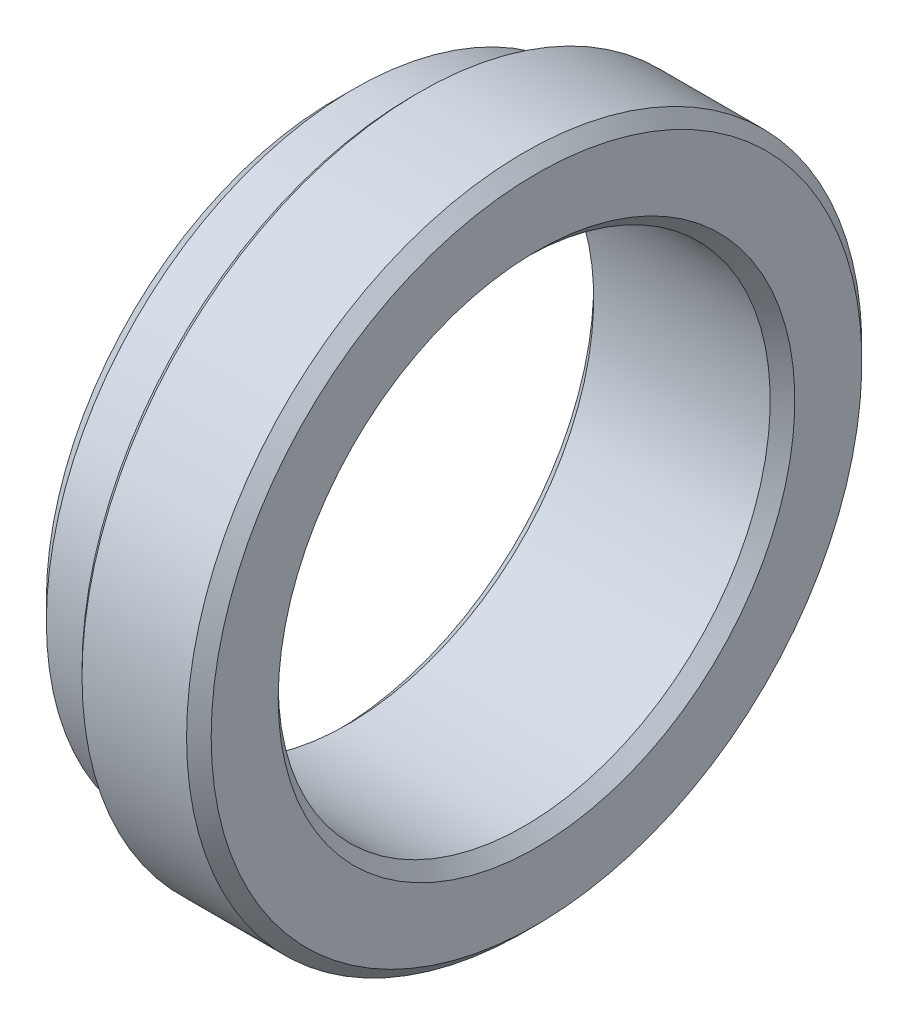
ISO-10303-21;
HEADER;
FILE_DESCRIPTION(('STEP AP214'),'2;1');
FILE_NAME('part.step','',(''),(''),'','','');
FILE_SCHEMA(('AUTOMOTIVE_DESIGN { 1 0 10303 214 1 1 1 1 }'));
ENDSEC;
DATA;
#1=APPLICATION_CONTEXT('core data for automotive mechanical design processes');
#2=APPLICATION_PROTOCOL_DEFINITION('international standard','automotive_design',2000,#1);
#3=PRODUCT_CONTEXT('',#1,'mechanical');
#4=PRODUCT('Part','Part','',(#3));
#5=PRODUCT_RELATED_PRODUCT_CATEGORY('part','',(#4));
#6=PRODUCT_DEFINITION_FORMATION('','',#4);
#7=PRODUCT_DEFINITION_CONTEXT('part definition',#1,'design');
#8=PRODUCT_DEFINITION('design','',#6,#7);
#9=PRODUCT_DEFINITION_SHAPE('','',#8);
#10=(LENGTH_UNIT() NAMED_UNIT(*) SI_UNIT(.MILLI.,.METRE.));
#11=(NAMED_UNIT(*) PLANE_ANGLE_UNIT() SI_UNIT($,.RADIAN.));
#12=(NAMED_UNIT(*) SI_UNIT($,.STERADIAN.) SOLID_ANGLE_UNIT());
#13=UNCERTAINTY_MEASURE_WITH_UNIT(LENGTH_MEASURE(1.E-05),#10,'distance_accuracy_value','');
#14=(GEOMETRIC_REPRESENTATION_CONTEXT(3) GLOBAL_UNCERTAINTY_ASSIGNED_CONTEXT((#13)) GLOBAL_UNIT_ASSIGNED_CONTEXT((#10,
#11,#12)) REPRESENTATION_CONTEXT('',''));
#15=CARTESIAN_POINT('',(0.,0.,0.));
#16=DIRECTION('',(0.,0.,1.));
#17=DIRECTION('',(1.,0.,0.));
#18=AXIS2_PLACEMENT_3D('',#15,#16,#17);
#19=CARTESIAN_POINT('',(0.,0.,0.));
#20=DIRECTION('',(-1.,0.,0.));
#21=DIRECTION('',(0.,0.,1.));
#22=AXIS2_PLACEMENT_3D('',#19,#20,#21);
#23=CONICAL_SURFACE('',#22,21.,0.785398163397449);
#24=CARTESIAN_POINT('',(1.,0.,0.));
#25=DIRECTION('',(-1.,0.,0.));
#26=DIRECTION('',(0.,0.,1.));
#27=AXIS2_PLACEMENT_3D('',#24,#25,#26);
#28=CIRCLE('',#27,20.);
#29=CARTESIAN_POINT('',(1.,0.,20.));
#30=VERTEX_POINT('',#29);
#31=EDGE_CURVE('E11',#30,#30,#28,.T.);
#32=ORIENTED_EDGE('',*,*,#31,.F.);
#33=EDGE_LOOP('',(#32));
#34=FACE_BOUND('',#33,.T.);
#35=CARTESIAN_POINT('',(0.,0.,0.));
#36=DIRECTION('',(-1.,0.,0.));
#37=DIRECTION('',(0.,0.,1.));
#38=AXIS2_PLACEMENT_3D('',#35,#36,#37);
#39=CIRCLE('',#38,21.);
#40=CARTESIAN_POINT('',(0.,0.,21.));
#41=VERTEX_POINT('',#40);
#42=EDGE_CURVE('E90',#41,#41,#39,.T.);
#43=ORIENTED_EDGE('',*,*,#42,.T.);
#44=EDGE_LOOP('',(#43));
#45=FACE_BOUND('',#44,.T.);
#46=ADVANCED_FACE('F50',(#34,#45),#23,.F.);
#47=CARTESIAN_POINT('',(0.,0.,0.));
#48=DIRECTION('',(-1.,0.,0.));
#49=DIRECTION('',(0.,0.,1.));
#50=AXIS2_PLACEMENT_3D('',#47,#48,#49);
#51=CYLINDRICAL_SURFACE('',#50,20.);
#52=CARTESIAN_POINT('',(15.35,0.,0.));
#53=DIRECTION('',(-1.,0.,0.));
#54=DIRECTION('',(0.,0.,1.));
#55=AXIS2_PLACEMENT_3D('',#52,#53,#54);
#56=CIRCLE('',#55,20.);
#57=CARTESIAN_POINT('',(15.35,0.,20.));
#58=VERTEX_POINT('',#57);
#59=EDGE_CURVE('E56',#58,#58,#56,.T.);
#60=ORIENTED_EDGE('',*,*,#59,.F.);
#61=EDGE_LOOP('',(#60));
#62=FACE_BOUND('',#61,.T.);
#63=ORIENTED_EDGE('',*,*,#31,.T.);
#64=EDGE_LOOP('',(#63));
#65=FACE_BOUND('',#64,.T.);
#66=ADVANCED_FACE('F151',(#62,#65),#51,.F.);
#67=CARTESIAN_POINT('',(15.35,0.,0.));
#68=DIRECTION('',(1.,0.,0.));
#69=DIRECTION('',(0.,0.,-1.));
#70=AXIS2_PLACEMENT_3D('',#67,#68,#69);
#71=CONICAL_SURFACE('',#70,20.,0.785398163397448);
#72=CARTESIAN_POINT('',(16.35,0.,0.));
#73=DIRECTION('',(-1.,0.,0.));
#74=DIRECTION('',(0.,0.,1.));
#75=AXIS2_PLACEMENT_3D('',#72,#73,#74);
#76=CIRCLE('',#75,21.);
#77=CARTESIAN_POINT('',(16.35,0.,21.));
#78=VERTEX_POINT('',#77);
#79=EDGE_CURVE('E60',#78,#78,#76,.T.);
#80=ORIENTED_EDGE('',*,*,#79,.F.);
#81=EDGE_LOOP('',(#80));
#82=FACE_BOUND('',#81,.T.);
#83=ORIENTED_EDGE('',*,*,#59,.T.);
#84=EDGE_LOOP('',(#83));
#85=FACE_BOUND('',#84,.T.);
#86=ADVANCED_FACE('F146',(#82,#85),#71,.F.);
#87=CARTESIAN_POINT('',(16.35,21.,0.));
#88=DIRECTION('',(-1.,0.,0.));
#89=DIRECTION('',(0.,0.,1.));
#90=AXIS2_PLACEMENT_3D('',#87,#88,#89);
#91=PLANE('',#90);
#92=CARTESIAN_POINT('',(16.35,0.,0.));
#93=DIRECTION('',(-1.,0.,0.));
#94=DIRECTION('',(0.,0.,1.));
#95=AXIS2_PLACEMENT_3D('',#92,#93,#94);
#96=CIRCLE('',#95,26.45);
#97=CARTESIAN_POINT('',(16.35,0.,26.45));
#98=VERTEX_POINT('',#97);
#99=EDGE_CURVE('E64',#98,#98,#96,.T.);
#100=ORIENTED_EDGE('',*,*,#99,.F.);
#101=EDGE_LOOP('',(#100));
#102=FACE_BOUND('',#101,.T.);
#103=ORIENTED_EDGE('',*,*,#79,.T.);
#104=EDGE_LOOP('',(#103));
#105=FACE_BOUND('',#104,.T.);
#106=ADVANCED_FACE('F140',(#102,#105),#91,.F.);
#107=CARTESIAN_POINT('',(16.35,0.,0.));
#108=DIRECTION('',(-1.,0.,0.));
#109=DIRECTION('',(0.,0.,1.));
#110=AXIS2_PLACEMENT_3D('',#107,#108,#109);
#111=CONICAL_SURFACE('',#110,26.45,0.785398163397448);
#112=CARTESIAN_POINT('',(15.35,0.,0.));
#113=DIRECTION('',(-1.,0.,0.));
#114=DIRECTION('',(0.,0.,1.));
#115=AXIS2_PLACEMENT_3D('',#112,#113,#114);
#116=CIRCLE('',#115,27.45);
#117=CARTESIAN_POINT('',(15.35,0.,27.45));
#118=VERTEX_POINT('',#117);
#119=EDGE_CURVE('E69',#118,#118,#116,.T.);
#120=ORIENTED_EDGE('',*,*,#119,.F.);
#121=EDGE_LOOP('',(#120));
#122=FACE_BOUND('',#121,.T.);
#123=ORIENTED_EDGE('',*,*,#99,.T.);
#124=EDGE_LOOP('',(#123));
#125=FACE_BOUND('',#124,.T.);
#126=ADVANCED_FACE('F134',(#122,#125),#111,.T.);
#127=CARTESIAN_POINT('',(0.,0.,0.));
#128=DIRECTION('',(-1.,0.,0.));
#129=DIRECTION('',(0.,0.,1.));
#130=AXIS2_PLACEMENT_3D('',#127,#128,#129);
#131=CYLINDRICAL_SURFACE('',#130,27.45);
#132=CARTESIAN_POINT('',(6.85,0.,0.));
#133=DIRECTION('',(-1.,0.,0.));
#134=DIRECTION('',(0.,0.,1.));
#135=AXIS2_PLACEMENT_3D('',#132,#133,#134);
#136=CIRCLE('',#135,27.45);
#137=CARTESIAN_POINT('',(6.85,0.,27.45));
#138=VERTEX_POINT('',#137);
#139=EDGE_CURVE('E72',#138,#138,#136,.T.);
#140=ORIENTED_EDGE('',*,*,#139,.F.);
#141=EDGE_LOOP('',(#140));
#142=FACE_BOUND('',#141,.T.);
#143=ORIENTED_EDGE('',*,*,#119,.T.);
#144=EDGE_LOOP('',(#143));
#145=FACE_BOUND('',#144,.T.);
#146=ADVANCED_FACE('F128',(#142,#145),#131,.T.);
#147=CARTESIAN_POINT('',(6.85,0.,0.));
#148=DIRECTION('',(1.,0.,0.));
#149=DIRECTION('',(0.,0.,-1.));
#150=AXIS2_PLACEMENT_3D('',#147,#148,#149);
#151=CONICAL_SURFACE('',#150,27.45,0.785398163397445);
#152=CARTESIAN_POINT('',(6.35,0.,0.));
#153=DIRECTION('',(-1.,0.,0.));
#154=DIRECTION('',(0.,0.,1.));
#155=AXIS2_PLACEMENT_3D('',#152,#153,#154);
#156=CIRCLE('',#155,26.95);
#157=CARTESIAN_POINT('',(6.35,0.,26.95));
#158=VERTEX_POINT('',#157);
#159=EDGE_CURVE('E75',#158,#158,#156,.T.);
#160=ORIENTED_EDGE('',*,*,#159,.F.);
#161=EDGE_LOOP('',(#160));
#162=FACE_BOUND('',#161,.T.);
#163=ORIENTED_EDGE('',*,*,#139,.T.);
#164=EDGE_LOOP('',(#163));
#165=FACE_BOUND('',#164,.T.);
#166=ADVANCED_FACE('F122',(#162,#165),#151,.T.);
#167=CARTESIAN_POINT('',(6.35,26.95,0.));
#168=DIRECTION('',(1.,0.,0.));
#169=DIRECTION('',(0.,0.,-1.));
#170=AXIS2_PLACEMENT_3D('',#167,#168,#169);
#171=PLANE('',#170);
#172=CARTESIAN_POINT('',(6.35,0.,0.));
#173=DIRECTION('',(-1.,0.,0.));
#174=DIRECTION('',(0.,0.,1.));
#175=AXIS2_PLACEMENT_3D('',#172,#173,#174);
#176=CIRCLE('',#175,25.);
#177=CARTESIAN_POINT('',(6.35,0.,25.));
#178=VERTEX_POINT('',#177);
#179=EDGE_CURVE('E78',#178,#178,#176,.T.);
#180=ORIENTED_EDGE('',*,*,#179,.F.);
#181=EDGE_LOOP('',(#180));
#182=FACE_BOUND('',#181,.T.);
#183=ORIENTED_EDGE('',*,*,#159,.T.);
#184=EDGE_LOOP('',(#183));
#185=FACE_BOUND('',#184,.T.);
#186=ADVANCED_FACE('F116',(#182,#185),#171,.F.);
#187=CARTESIAN_POINT('',(5.85,0.,0.));
#188=DIRECTION('',(-1.,0.,0.));
#189=DIRECTION('',(0.,0.,1.));
#190=AXIS2_PLACEMENT_3D('',#187,#188,#189);
#191=TOROIDAL_SURFACE('',#190,25.,0.5);
#192=CARTESIAN_POINT('',(5.35,0.,0.));
#193=DIRECTION('',(-1.,0.,0.));
#194=DIRECTION('',(0.,0.,1.));
#195=AXIS2_PLACEMENT_3D('',#192,#193,#194);
#196=CIRCLE('',#195,25.);
#197=CARTESIAN_POINT('',(5.35,0.,25.));
#198=VERTEX_POINT('',#197);
#199=EDGE_CURVE('E81',#198,#198,#196,.T.);
#200=ORIENTED_EDGE('',*,*,#199,.F.);
#201=EDGE_LOOP('',(#200));
#202=FACE_BOUND('',#201,.T.);
#203=ORIENTED_EDGE('',*,*,#179,.T.);
#204=EDGE_LOOP('',(#203));
#205=FACE_BOUND('',#204,.T.);
#206=ADVANCED_FACE('F110',(#202,#205),#191,.F.);
#207=CARTESIAN_POINT('',(0.,0.,0.));
#208=DIRECTION('',(-1.,0.,0.));
#209=DIRECTION('',(0.,0.,1.));
#210=AXIS2_PLACEMENT_3D('',#207,#208,#209);
#211=CYLINDRICAL_SURFACE('',#210,25.);
#212=CARTESIAN_POINT('',(1.5,0.,0.));
#213=DIRECTION('',(-1.,0.,0.));
#214=DIRECTION('',(0.,0.,1.));
#215=AXIS2_PLACEMENT_3D('',#212,#213,#214);
#216=CIRCLE('',#215,25.);
#217=CARTESIAN_POINT('',(1.5,0.,25.));
#218=VERTEX_POINT('',#217);
#219=EDGE_CURVE('E84',#218,#218,#216,.T.);
#220=ORIENTED_EDGE('',*,*,#219,.F.);
#221=EDGE_LOOP('',(#220));
#222=FACE_BOUND('',#221,.T.);
#223=ORIENTED_EDGE('',*,*,#199,.T.);
#224=EDGE_LOOP('',(#223));
#225=FACE_BOUND('',#224,.T.);
#226=ADVANCED_FACE('F104',(#222,#225),#211,.T.);
#227=CARTESIAN_POINT('',(1.5,0.,0.));
#228=DIRECTION('',(1.,0.,0.));
#229=DIRECTION('',(0.,0.,-1.));
#230=AXIS2_PLACEMENT_3D('',#227,#228,#229);
#231=CONICAL_SURFACE('',#230,25.,0.785398163397449);
#232=CARTESIAN_POINT('',(0.,0.,0.));
#233=DIRECTION('',(-1.,0.,0.));
#234=DIRECTION('',(0.,0.,1.));
#235=AXIS2_PLACEMENT_3D('',#232,#233,#234);
#236=CIRCLE('',#235,23.5);
#237=CARTESIAN_POINT('',(0.,0.,23.5));
#238=VERTEX_POINT('',#237);
#239=EDGE_CURVE('E87',#238,#238,#236,.T.);
#240=ORIENTED_EDGE('',*,*,#239,.F.);
#241=EDGE_LOOP('',(#240));
#242=FACE_BOUND('',#241,.T.);
#243=ORIENTED_EDGE('',*,*,#219,.T.);
#244=EDGE_LOOP('',(#243));
#245=FACE_BOUND('',#244,.T.);
#246=ADVANCED_FACE('F98',(#242,#245),#231,.T.);
#247=CARTESIAN_POINT('',(0.,23.5,0.));
#248=DIRECTION('',(1.,0.,0.));
#249=DIRECTION('',(0.,0.,-1.));
#250=AXIS2_PLACEMENT_3D('',#247,#248,#249);
#251=PLANE('',#250);
#252=ORIENTED_EDGE('',*,*,#42,.F.);
#253=EDGE_LOOP('',(#252));
#254=FACE_BOUND('',#253,.T.);
#255=ORIENTED_EDGE('',*,*,#239,.T.);
#256=EDGE_LOOP('',(#255));
#257=FACE_BOUND('',#256,.T.);
#258=ADVANCED_FACE('F95',(#254,#257),#251,.F.);
#259=CLOSED_SHELL('',(#46,#66,#86,#106,#126,#146,#166,#186,#206,#226,#246,#258));
#260=MANIFOLD_SOLID_BREP('B2',#259);
#261=ADVANCED_BREP_SHAPE_REPRESENTATION('',(#18,#260),#14);
#262=SHAPE_DEFINITION_REPRESENTATION(#9,#261);
ENDSEC;
END-ISO-10303-21;
